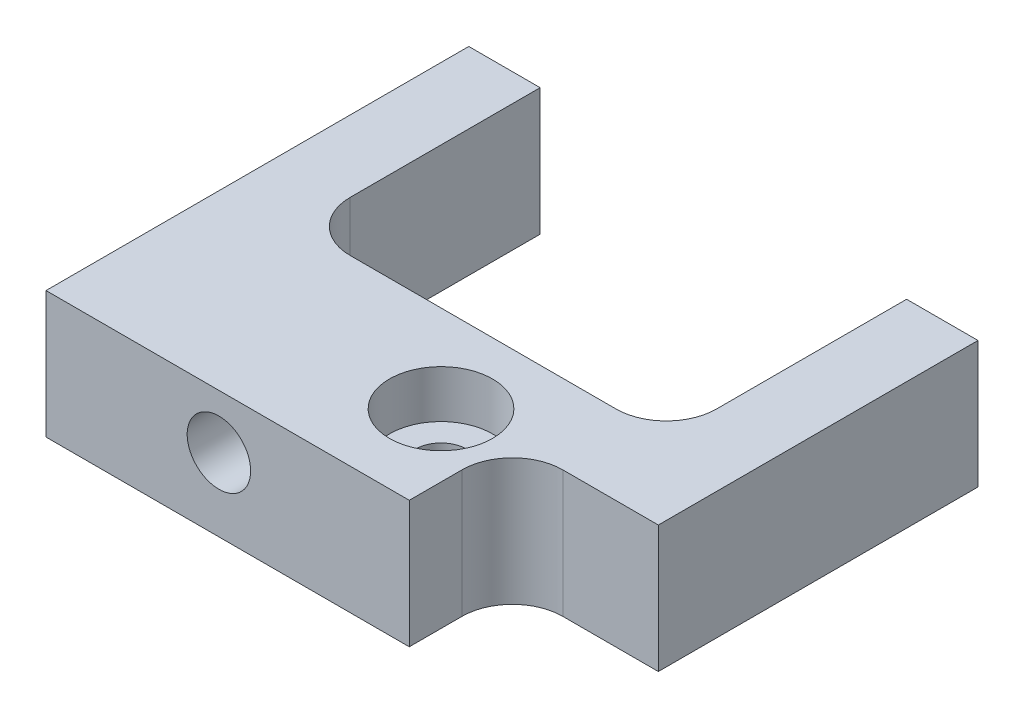
ISO-10303-21;
HEADER;
FILE_DESCRIPTION(('STEP AP214'),'2;1');
FILE_NAME('part.step','',(''),(''),'','','');
FILE_SCHEMA(('AUTOMOTIVE_DESIGN { 1 0 10303 214 1 1 1 1 }'));
ENDSEC;
DATA;
#1=APPLICATION_CONTEXT('core data for automotive mechanical design processes');
#2=APPLICATION_PROTOCOL_DEFINITION('international standard','automotive_design',2000,#1);
#3=PRODUCT_CONTEXT('',#1,'mechanical');
#4=PRODUCT('Part','Part','',(#3));
#5=PRODUCT_RELATED_PRODUCT_CATEGORY('part','',(#4));
#6=PRODUCT_DEFINITION_FORMATION('','',#4);
#7=PRODUCT_DEFINITION_CONTEXT('part definition',#1,'design');
#8=PRODUCT_DEFINITION('design','',#6,#7);
#9=PRODUCT_DEFINITION_SHAPE('','',#8);
#10=(LENGTH_UNIT() NAMED_UNIT(*) SI_UNIT(.MILLI.,.METRE.));
#11=(NAMED_UNIT(*) PLANE_ANGLE_UNIT() SI_UNIT($,.RADIAN.));
#12=(NAMED_UNIT(*) SI_UNIT($,.STERADIAN.) SOLID_ANGLE_UNIT());
#13=UNCERTAINTY_MEASURE_WITH_UNIT(LENGTH_MEASURE(1.E-05),#10,'distance_accuracy_value','');
#14=(GEOMETRIC_REPRESENTATION_CONTEXT(3) GLOBAL_UNCERTAINTY_ASSIGNED_CONTEXT((#13)) GLOBAL_UNIT_ASSIGNED_CONTEXT((#10,
#11,#12)) REPRESENTATION_CONTEXT('',''));
#15=CARTESIAN_POINT('',(0.,0.,0.));
#16=DIRECTION('',(0.,0.,1.));
#17=DIRECTION('',(1.,0.,0.));
#18=AXIS2_PLACEMENT_3D('',#15,#16,#17);
#19=CARTESIAN_POINT('',(0.,0.6,-20.65));
#20=DIRECTION('',(0.,0.,1.));
#21=DIRECTION('',(1.,0.,0.));
#22=AXIS2_PLACEMENT_3D('',#19,#20,#21);
#23=CYLINDRICAL_SURFACE('',#22,2.);
#24=CARTESIAN_POINT('',(0.,0.6,6.));
#25=DIRECTION('',(0.,0.,1.));
#26=DIRECTION('',(1.,0.,0.));
#27=AXIS2_PLACEMENT_3D('',#24,#25,#26);
#28=CIRCLE('',#27,2.);
#29=CARTESIAN_POINT('',(2.,0.6,6.));
#30=VERTEX_POINT('',#29);
#31=EDGE_CURVE('E216',#30,#30,#28,.T.);
#32=ORIENTED_EDGE('',*,*,#31,.T.);
#33=EDGE_LOOP('',(#32));
#34=FACE_BOUND('',#33,.T.);
#35=CARTESIAN_POINT('',(0.,0.6,-5.5));
#36=DIRECTION('',(0.,0.,1.));
#37=DIRECTION('',(1.,0.,0.));
#38=AXIS2_PLACEMENT_3D('',#35,#36,#37);
#39=CIRCLE('',#38,2.);
#40=CARTESIAN_POINT('',(2.,0.6,-5.5));
#41=VERTEX_POINT('',#40);
#42=EDGE_CURVE('E220',#41,#41,#39,.T.);
#43=ORIENTED_EDGE('',*,*,#42,.F.);
#44=EDGE_LOOP('',(#43));
#45=FACE_BOUND('',#44,.T.);
#46=CARTESIAN_POINT('',(2.,0.6,-1.6));
#47=CARTESIAN_POINT('',(2.00000081167368,0.530930232430908,-1.65180741795076));
#48=CARTESIAN_POINT('',(1.99641070395367,0.458493593826792,-1.699115629872));
#49=CARTESIAN_POINT('',(1.98012704087393,0.308900810169037,-1.78360734161533));
#50=CARTESIAN_POINT('',(1.96744188471003,0.231749079550651,-1.82080013925272));
#51=CARTESIAN_POINT('',(1.93158493327812,0.0751720335122647,-1.88449186499489));
#52=CARTESIAN_POINT('',(1.90838027108809,-0.00425967126894958,-1.91095678049753));
#53=CARTESIAN_POINT('',(1.85104297813442,-0.162026108753398,-1.95316471259814));
#54=CARTESIAN_POINT('',(1.81690813535857,-0.240360616057411,-1.96890555687711));
#55=CARTESIAN_POINT('',(1.73965206641096,-0.390182657924855,-1.99035271701722));
#56=CARTESIAN_POINT('',(1.69690429465275,-0.461815743414621,-1.99640430328593));
#57=CARTESIAN_POINT('',(1.60268097641294,-0.599320485146133,-2.00118457756281));
#58=CARTESIAN_POINT('',(1.55120278894355,-0.665190388833636,-1.99991104584322));
#59=CARTESIAN_POINT('',(1.43498824815135,-0.79615054910046,-1.99154760631992));
#60=CARTESIAN_POINT('',(1.3694350071139,-0.860475280037611,-1.98387740791269));
#61=CARTESIAN_POINT('',(1.23048079025559,-0.979333574383771,-1.96462162845022));
#62=CARTESIAN_POINT('',(1.1570734516767,-1.03385910197419,-1.95303285621111));
#63=CARTESIAN_POINT('',(0.990405979628008,-1.14083761045381,-1.92640580221497));
#64=CARTESIAN_POINT('',(0.895906296875015,-1.19130781741316,-1.91111739179622));
#65=CARTESIAN_POINT('',(0.699787270883814,-1.2766292102228,-1.88260580533857));
#66=CARTESIAN_POINT('',(0.598166856798842,-1.31147804100799,-1.86938294089523));
#67=CARTESIAN_POINT('',(0.384528928037567,-1.36593595822834,-1.84777354925079));
#68=CARTESIAN_POINT('',(0.272245825535434,-1.38463910775565,-1.83968060299791));
#69=CARTESIAN_POINT('',(0.0458874054833726,-1.40268973092312,-1.83188406880462));
#70=CARTESIAN_POINT('',(-0.0681866126450627,-1.40205064372051,-1.83217465590448));
#71=CARTESIAN_POINT('',(-0.285164572178313,-1.38232158760235,-1.84066746868414));
#72=CARTESIAN_POINT('',(-0.388233476384271,-1.36470801976279,-1.84823651616043));
#73=CARTESIAN_POINT('',(-0.589935560871737,-1.31384652395174,-1.86846584639397));
#74=CARTESIAN_POINT('',(-0.688566008650018,-1.28058910541913,-1.88112921901886));
#75=CARTESIAN_POINT('',(-0.882719390105117,-1.19787205747392,-1.90906058040478));
#76=CARTESIAN_POINT('',(-0.977997627654943,-1.14786552637516,-1.92440674591741));
#77=CARTESIAN_POINT('',(-1.15955897606969,-1.03308874546562,-1.95344429855302));
#78=CARTESIAN_POINT('',(-1.24583633547345,-0.968309139023642,-1.96713462849491));
#79=CARTESIAN_POINT('',(-1.41155089132897,-0.821393025739891,-1.98915941028867));
#80=CARTESIAN_POINT('',(-1.49040129047882,-0.73853059400089,-1.99717927513557));
#81=CARTESIAN_POINT('',(-1.5972127477114,-0.605061111948833,-2.00048948485742));
#82=CARTESIAN_POINT('',(-1.63090004515022,-0.559052530559337,-2.00014060479855));
#83=CARTESIAN_POINT('',(-1.69416251200746,-0.464448985210965,-1.9959635335001));
#84=CARTESIAN_POINT('',(-1.7237387456667,-0.41585469514182,-1.99213624466568));
#85=CARTESIAN_POINT('',(-1.79803587903694,-0.281171095771729,-1.97627175473062));
#86=CARTESIAN_POINT('',(-1.83848729704135,-0.193089320010061,-1.96032331380911));
#87=CARTESIAN_POINT('',(-1.90539212376168,-0.0152312666545765,-1.91479887308592));
#88=CARTESIAN_POINT('',(-1.9318566425983,0.0745436071832343,-1.88523372439649));
#89=CARTESIAN_POINT('',(-1.96866746103482,0.238852481739783,-1.8174418692137));
#90=CARTESIAN_POINT('',(-1.98075702546884,0.313754412672703,-1.78101783013734));
#91=CARTESIAN_POINT('',(-1.99636567355134,0.459051203164299,-1.69864278590973));
#92=CARTESIAN_POINT('',(-1.99988306922272,0.529445172386899,-1.65268990633237));
#93=CARTESIAN_POINT('',(-2.00011658431104,0.666955273371109,-1.5500090005869));
#94=CARTESIAN_POINT('',(-1.99651270706146,0.733772088196243,-1.49288283420442));
#95=CARTESIAN_POINT('',(-1.98414700408956,0.85909974044818,-1.37065814891648));
#96=CARTESIAN_POINT('',(-1.97538239442267,0.91760607364574,-1.30555534205408));
#97=CARTESIAN_POINT('',(-1.95328799158352,1.03448050470643,-1.15707789094646));
#98=CARTESIAN_POINT('',(-1.93943951797251,1.09118501797098,-1.07246906865233));
#99=CARTESIAN_POINT('',(-1.91135188176099,1.19112991016757,-0.895647483200536));
#100=CARTESIAN_POINT('',(-1.89711242088801,1.23435968057233,-0.803428800750606));
#101=CARTESIAN_POINT('',(-1.87001941903887,1.31053440638709,-0.60223790975111));
#102=CARTESIAN_POINT('',(-1.85750809303621,1.34174871383939,-0.492553504867468));
#103=CARTESIAN_POINT('',(-1.83961918954031,1.38509437338627,-0.26896038986554));
#104=CARTESIAN_POINT('',(-1.83423474348132,1.39724410116212,-0.15505585594007));
#105=CARTESIAN_POINT('',(-1.83225388534824,1.40177504594101,0.0662061879268429));
#106=CARTESIAN_POINT('',(-1.83513827814024,1.39532404085202,0.173536352909603));
#107=CARTESIAN_POINT('',(-1.84780026230027,1.36543337140907,0.385391843029078));
#108=CARTESIAN_POINT('',(-1.85758055948655,1.3419870383189,0.489916050445269));
#109=CARTESIAN_POINT('',(-1.88130399760412,1.27954141774594,0.691575995261232));
#110=CARTESIAN_POINT('',(-1.89516952431449,1.24082791568247,0.788810467881536));
#111=CARTESIAN_POINT('',(-1.92383805123334,1.14878594113083,0.9760329730363));
#112=CARTESIAN_POINT('',(-1.93864185145134,1.09544486410837,1.06601466895282));
#113=CARTESIAN_POINT('',(-1.96660649456734,0.970039239988648,1.24411331699019));
#114=CARTESIAN_POINT('',(-1.97952276673733,0.896773339291135,1.33143004993891));
#115=CARTESIAN_POINT('',(-1.9970018340399,0.735953168078853,1.49269118325014));
#116=CARTESIAN_POINT('',(-2.00157942041929,0.648424498168381,1.5666590515067));
#117=CARTESIAN_POINT('',(-1.99792708931293,0.484826250909298,1.68244782159104));
#118=CARTESIAN_POINT('',(-1.9925346133196,0.411127455459566,1.72771430332882));
#119=CARTESIAN_POINT('',(-1.97228553400472,0.259532164531531,1.80790906738676));
#120=CARTESIAN_POINT('',(-1.95743709423633,0.181639342902521,1.84284622919034));
#121=CARTESIAN_POINT('',(-1.91707168527508,0.0242873526634313,1.90193282767127));
#122=CARTESIAN_POINT('',(-1.89152824635684,-0.0551752328902149,1.92605518924901));
#123=CARTESIAN_POINT('',(-1.82954645398747,-0.212340721030698,1.96373574441791));
#124=CARTESIAN_POINT('',(-1.79310496292164,-0.290043109906346,1.97729089158538));
#125=CARTESIAN_POINT('',(-1.71136373138261,-0.438351715550521,1.99481107899165));
#126=CARTESIAN_POINT('',(-1.66639564813615,-0.509107426905006,1.99907756112358));
#127=CARTESIAN_POINT('',(-1.56791857614722,-0.644445526318661,2.00065276451401));
#128=CARTESIAN_POINT('',(-1.51440714805211,-0.709026142777655,1.99795949523263));
#129=CARTESIAN_POINT('',(-1.3932664707025,-0.837886655717559,1.98697505102131));
#130=CARTESIAN_POINT('',(-1.32471783147404,-0.901246134308137,1.97806540601163));
#131=CARTESIAN_POINT('',(-1.17979785027534,-1.01763206596044,1.95680614763648));
#132=CARTESIAN_POINT('',(-1.10341953102513,-1.07064917832831,1.94445344890854));
#133=CARTESIAN_POINT('',(-0.930611174751638,-1.17361620410465,1.91683918180251));
#134=CARTESIAN_POINT('',(-0.832976952264578,-1.2215222672066,1.90143950265747));
#135=CARTESIAN_POINT('',(-0.630867255300358,-1.30099840250781,1.87360209770341));
#136=CARTESIAN_POINT('',(-0.526392543709775,-1.33257029289404,1.86116404231382));
#137=CARTESIAN_POINT('',(-0.30980204904424,-1.37905197403248,1.84221278744531));
#138=CARTESIAN_POINT('',(-0.197549995458754,-1.39341808942808,1.83589406419166));
#139=CARTESIAN_POINT('',(0.0278877008999224,-1.40298213030672,1.83173546045223));
#140=CARTESIAN_POINT('',(0.141072817525358,-1.39819020750826,1.8338910894528));
#141=CARTESIAN_POINT('',(0.355819526239452,-1.37083636803646,1.84553290648091));
#142=CARTESIAN_POINT('',(0.457599488764074,-1.34968857796929,1.85443464609825));
#143=CARTESIAN_POINT('',(0.65627037675498,-1.29209407315778,1.87668620073566));
#144=CARTESIAN_POINT('',(0.753157232070508,-1.25563484954419,1.89003965079366));
#145=CARTESIAN_POINT('',(0.944960910720817,-1.16602573521248,1.91883823994639));
#146=CARTESIAN_POINT('',(1.03950055430254,-1.11209301122148,1.93435676253174));
#147=CARTESIAN_POINT('',(1.21885880929599,-0.989393472038473,1.96273473362634));
#148=CARTESIAN_POINT('',(1.30368205078825,-0.920633767636342,1.97559545100776));
#149=CARTESIAN_POINT('',(1.45077870732479,-0.77991152693392,1.99297615784251));
#150=CARTESIAN_POINT('',(1.51455050217948,-0.709630863559676,1.99838694076718));
#151=CARTESIAN_POINT('',(1.63153705090065,-0.56061874765793,2.0009961388745));
#152=CARTESIAN_POINT('',(1.68476064067449,-0.481894454035504,1.99820145882578));
#153=CARTESIAN_POINT('',(1.77945498065592,-0.317908136994111,1.98172846075181));
#154=CARTESIAN_POINT('',(1.82084276009074,-0.23260503874639,1.96797575010158));
#155=CARTESIAN_POINT('',(1.89037516714184,-0.0596621991097205,1.92766556519411));
#156=CARTESIAN_POINT('',(1.91852733772989,0.0279761812349006,1.90111540171992));
#157=CARTESIAN_POINT('',(1.95938749973833,0.191269888130147,1.8386509466133));
#158=CARTESIAN_POINT('',(1.97350968805391,0.267134590088476,1.8041827461507));
#159=CARTESIAN_POINT('',(1.99279851248597,0.414792764149142,1.72545596541142));
#160=CARTESIAN_POINT('',(1.99796319137545,0.486585343173608,1.68119524783907));
#161=CARTESIAN_POINT('',(2.00108397849849,0.626086116798666,1.58247710311655));
#162=CARTESIAN_POINT('',(1.99882403529726,0.693612556818483,1.52775849844612));
#163=CARTESIAN_POINT('',(1.98880175814885,0.820776597099821,1.41028362715986));
#164=CARTESIAN_POINT('',(1.98103686330874,0.880410510445559,1.3475236308407));
#165=CARTESIAN_POINT('',(1.96071137214926,0.999812730518181,1.20442043672629));
#166=CARTESIAN_POINT('',(1.94757831957524,1.0580433665156,1.12287503675407));
#167=CARTESIAN_POINT('',(1.92026107001239,1.16167153531078,0.952106894804565));
#168=CARTESIAN_POINT('',(1.90607594360953,1.20705754641604,0.862877353084684));
#169=CARTESIAN_POINT('',(1.87810742365832,1.2890856142956,0.666399859636045));
#170=CARTESIAN_POINT('',(1.86461212206336,1.32384335610252,0.558312665279804));
#171=CARTESIAN_POINT('',(1.84411281410941,1.37460894789826,0.337270760359234));
#172=CARTESIAN_POINT('',(1.83710288312593,1.39063391450044,0.224320591236239));
#173=CARTESIAN_POINT('',(1.83176302428134,1.40292287621779,0.002692968837738));
#174=CARTESIAN_POINT('',(1.83302507536412,1.40011561734224,-0.105923051901108));
#175=CARTESIAN_POINT('',(1.84291982065536,1.37704294075041,-0.320937355398722));
#176=CARTESIAN_POINT('',(1.85155430101119,1.3567732923418,-0.427335094325882));
#177=CARTESIAN_POINT('',(1.87351965177648,1.30056204027455,-0.631426625214853));
#178=CARTESIAN_POINT('',(1.88668220159995,1.26517239607616,-0.729292976581497));
#179=CARTESIAN_POINT('',(1.91465018828688,1.17976617656696,-0.918257574761771));
#180=CARTESIAN_POINT('',(1.92945726035384,1.12973496037857,-1.00934893200018));
#181=CARTESIAN_POINT('',(1.95866892098325,1.0096889039612,-1.19255486354033));
#182=CARTESIAN_POINT('',(1.97284748895516,0.938074953221956,-1.28366636456944));
#183=CARTESIAN_POINT('',(1.99350586232903,0.779652015677594,-1.45254808860173));
#184=CARTESIAN_POINT('',(1.99999890864414,0.692869458932587,-1.53034105885808));
#185=CARTESIAN_POINT('',(2.,0.6,-1.6));
#186=B_SPLINE_CURVE_WITH_KNOTS('',3,(#46,#47,#48,#49,#50,#51,#52,#53,#54,#55,#56,#57,#58,#59,
#60,#61,#62,#63,#64,#65,#66,#67,#68,#69,#70,#71,#72,#73,#74,#75,#76,#77,#78,#79,#80,#81,#82,#83,
#84,#85,#86,#87,#88,#89,#90,#91,#92,#93,#94,#95,#96,#97,#98,#99,#100,#101,#102,#103,#104,#105,
#106,#107,#108,#109,#110,#111,#112,#113,#114,#115,#116,#117,#118,#119,#120,#121,#122,#123,#124,
#125,#126,#127,#128,#129,#130,#131,#132,#133,#134,#135,#136,#137,#138,#139,#140,#141,#142,#143,
#144,#145,#146,#147,#148,#149,#150,#151,#152,#153,#154,#155,#156,#157,#158,#159,#160,#161,#162,
#163,#164,#165,#166,#167,#168,#169,#170,#171,#172,#173,#174,#175,#176,#177,#178,#179,#180,#181,
#182,#183,#184,#185),.UNSPECIFIED.,.T.,.F.,(4,2,2,2,2,2,2,2,2,2,2,2,2,2,2,2,2,2,2,2,2,2,2,2,2,2,
2,2,2,2,2,2,2,2,2,2,2,2,2,2,2,2,2,2,2,2,2,2,2,2,2,2,2,2,2,2,2,2,2,2,2,2,2,2,2,2,2,2,2,4),(0.,
0.258704692950136,0.517170781647821,0.776450042023576,1.0357818076389,1.28564852242651,
1.53559095821911,1.81103967058162,2.08671324358595,2.40997725003623,2.73328997511033,
3.07374408183514,3.41396164346818,3.72703074255344,4.04029001482903,4.3649793432232,
4.68987488984253,5.03162007465946,5.2024214366164,5.37317850014325,5.66588716123469,
5.95836296622569,6.20970981791408,6.4611061592326,6.72405597558775,6.98714776970556,
7.29429359962567,7.60168063508981,7.94405429443354,8.28609774863279,8.60714356501621,
8.92831542366395,9.24374075328691,9.55943874263811,9.90181610634699,10.2435855639794,
10.5024496992631,10.7610906535333,11.0203755541777,11.2797351764874,11.5305439865519,
11.7814245377111,12.0616774708878,12.3421823540458,12.670243015467,12.9982671519886,
13.3364038159761,13.6743613273226,13.9859779911024,14.2978497308254,14.6262662825671,
14.954525679737,15.2385252046247,15.5222858168686,15.80798942631,16.0935300153382,
16.3459002090257,16.5983255389719,16.8581605912355,17.118116597649,17.4201096724678,
17.722372784143,18.0636437401914,18.4046026239387,18.7288744956192,19.0532249522179,
19.3666296739816,19.6803488627194,20.0287978352966,20.3766456086884),.UNSPECIFIED.);
#187=CARTESIAN_POINT('',(2.,0.6,-1.6));
#188=VERTEX_POINT('',#187);
#189=EDGE_CURVE('E50',#188,#188,#186,.T.);
#190=ORIENTED_EDGE('',*,*,#189,.F.);
#191=EDGE_LOOP('',(#190));
#192=FACE_BOUND('',#191,.T.);
#193=ADVANCED_FACE('F46',(#34,#45,#192),#23,.F.);
#194=CARTESIAN_POINT('',(21.2,4.,-20.65));
#195=DIRECTION('',(-1.,0.,0.));
#196=DIRECTION('',(0.,0.,1.));
#197=AXIS2_PLACEMENT_3D('',#194,#195,#196);
#198=PLANE('',#197);
#199=DIRECTION('',(0.,0.,-1.));
#200=VECTOR('',#199,1.);
#201=CARTESIAN_POINT('',(21.2,-4.,-20.65));
#202=LINE('',#201,#200);
#203=CARTESIAN_POINT('',(21.2,-4.,-0.500000000000002));
#204=VERTEX_POINT('',#203);
#205=CARTESIAN_POINT('',(21.2,-4.,-20.65));
#206=VERTEX_POINT('',#205);
#207=EDGE_CURVE('E224',#204,#206,#202,.T.);
#208=ORIENTED_EDGE('',*,*,#207,.T.);
#209=DIRECTION('',(0.,-1.,0.));
#210=VECTOR('',#209,1.);
#211=CARTESIAN_POINT('',(21.2,4.,-20.65));
#212=LINE('',#211,#210);
#213=CARTESIAN_POINT('',(21.2,4.,-20.65));
#214=VERTEX_POINT('',#213);
#215=EDGE_CURVE('E314',#214,#206,#212,.T.);
#216=ORIENTED_EDGE('',*,*,#215,.F.);
#217=DIRECTION('',(0.,0.,-1.));
#218=VECTOR('',#217,1.);
#219=CARTESIAN_POINT('',(21.2,4.,-20.65));
#220=LINE('',#219,#218);
#221=CARTESIAN_POINT('',(21.2,4.,-0.500000000000002));
#222=VERTEX_POINT('',#221);
#223=EDGE_CURVE('E225',#222,#214,#220,.T.);
#224=ORIENTED_EDGE('',*,*,#223,.F.);
#225=DIRECTION('',(0.,-1.,0.));
#226=VECTOR('',#225,1.);
#227=CARTESIAN_POINT('',(21.2,4.,-0.500000000000002));
#228=LINE('',#227,#226);
#229=EDGE_CURVE('E258',#222,#204,#228,.T.);
#230=ORIENTED_EDGE('',*,*,#229,.T.);
#231=EDGE_LOOP('',(#208,#216,#224,#230));
#232=FACE_BOUND('',#231,.T.);
#233=ADVANCED_FACE('F394',(#232),#198,.F.);
#234=CARTESIAN_POINT('',(21.2,4.,-20.65));
#235=DIRECTION('',(0.,0.,1.));
#236=DIRECTION('',(1.,0.,0.));
#237=AXIS2_PLACEMENT_3D('',#234,#235,#236);
#238=PLANE('',#237);
#239=CARTESIAN_POINT('',(19.05,0.6,-20.65));
#240=DIRECTION('',(0.,0.,-1.));
#241=DIRECTION('',(-1.,0.,0.));
#242=AXIS2_PLACEMENT_3D('',#239,#240,#241);
#243=CIRCLE('',#242,0.750000000000001);
#244=CARTESIAN_POINT('',(18.3,0.6,-20.65));
#245=VERTEX_POINT('',#244);
#246=EDGE_CURVE('E191',#245,#245,#243,.T.);
#247=ORIENTED_EDGE('',*,*,#246,.F.);
#248=EDGE_LOOP('',(#247));
#249=FACE_BOUND('',#248,.T.);
#250=DIRECTION('',(-1.,0.,0.));
#251=VECTOR('',#250,1.);
#252=CARTESIAN_POINT('',(21.2,-4.,-20.65));
#253=LINE('',#252,#251);
#254=CARTESIAN_POINT('',(16.7,-4.,-20.65));
#255=VERTEX_POINT('',#254);
#256=EDGE_CURVE('E262',#206,#255,#253,.T.);
#257=ORIENTED_EDGE('',*,*,#256,.T.);
#258=DIRECTION('',(0.,-1.,0.));
#259=VECTOR('',#258,1.);
#260=CARTESIAN_POINT('',(16.7,4.,-20.65));
#261=LINE('',#260,#259);
#262=CARTESIAN_POINT('',(16.7,4.,-20.65));
#263=VERTEX_POINT('',#262);
#264=EDGE_CURVE('E310',#263,#255,#261,.T.);
#265=ORIENTED_EDGE('',*,*,#264,.F.);
#266=DIRECTION('',(-1.,0.,0.));
#267=VECTOR('',#266,1.);
#268=CARTESIAN_POINT('',(21.2,4.,-20.65));
#269=LINE('',#268,#267);
#270=EDGE_CURVE('E229',#214,#263,#269,.T.);
#271=ORIENTED_EDGE('',*,*,#270,.F.);
#272=ORIENTED_EDGE('',*,*,#215,.T.);
#273=EDGE_LOOP('',(#257,#265,#271,#272));
#274=FACE_BOUND('',#273,.T.);
#275=ADVANCED_FACE('F400',(#249,#274),#238,.F.);
#276=CARTESIAN_POINT('',(16.7,4.,-20.65));
#277=DIRECTION('',(1.,0.,0.));
#278=DIRECTION('',(0.,0.,-1.));
#279=AXIS2_PLACEMENT_3D('',#276,#277,#278);
#280=PLANE('',#279);
#281=DIRECTION('',(0.,0.,1.));
#282=VECTOR('',#281,1.);
#283=CARTESIAN_POINT('',(16.7,-4.,-20.65));
#284=LINE('',#283,#282);
#285=CARTESIAN_POINT('',(16.7,-4.,-8.675));
#286=VERTEX_POINT('',#285);
#287=EDGE_CURVE('E265',#255,#286,#284,.T.);
#288=ORIENTED_EDGE('',*,*,#287,.T.);
#289=DIRECTION('',(0.,-1.,0.));
#290=VECTOR('',#289,1.);
#291=CARTESIAN_POINT('',(16.7,4.,-8.675));
#292=LINE('',#291,#290);
#293=CARTESIAN_POINT('',(16.7,4.,-8.675));
#294=VERTEX_POINT('',#293);
#295=EDGE_CURVE('E332',#286,#294,#292,.F.);
#296=ORIENTED_EDGE('',*,*,#295,.T.);
#297=DIRECTION('',(0.,0.,1.));
#298=VECTOR('',#297,1.);
#299=CARTESIAN_POINT('',(16.7,4.,-20.65));
#300=LINE('',#299,#298);
#301=EDGE_CURVE('E232',#263,#294,#300,.T.);
#302=ORIENTED_EDGE('',*,*,#301,.F.);
#303=ORIENTED_EDGE('',*,*,#264,.T.);
#304=EDGE_LOOP('',(#288,#296,#302,#303));
#305=FACE_BOUND('',#304,.T.);
#306=ADVANCED_FACE('F402',(#305),#280,.F.);
#307=CARTESIAN_POINT('',(16.7,4.,-5.5));
#308=DIRECTION('',(0.,0.,1.));
#309=DIRECTION('',(1.,0.,0.));
#310=AXIS2_PLACEMENT_3D('',#307,#308,#309);
#311=PLANE('',#310);
#312=ORIENTED_EDGE('',*,*,#42,.T.);
#313=EDGE_LOOP('',(#312));
#314=FACE_BOUND('',#313,.T.);
#315=DIRECTION('',(-1.,0.,0.));
#316=VECTOR('',#315,1.);
#317=CARTESIAN_POINT('',(16.7,4.,-5.5));
#318=LINE('',#317,#316);
#319=CARTESIAN_POINT('',(13.525,4.,-5.5));
#320=VERTEX_POINT('',#319);
#321=CARTESIAN_POINT('',(-3.22500000000005,4.,-5.5));
#322=VERTEX_POINT('',#321);
#323=EDGE_CURVE('E236',#320,#322,#318,.T.);
#324=ORIENTED_EDGE('',*,*,#323,.F.);
#325=DIRECTION('',(0.,-1.,0.));
#326=VECTOR('',#325,1.);
#327=CARTESIAN_POINT('',(13.525,-4.,-5.5));
#328=LINE('',#327,#326);
#329=CARTESIAN_POINT('',(13.525,-4.,-5.5));
#330=VERTEX_POINT('',#329);
#331=EDGE_CURVE('E328',#320,#330,#328,.T.);
#332=ORIENTED_EDGE('',*,*,#331,.T.);
#333=DIRECTION('',(-1.,0.,0.));
#334=VECTOR('',#333,1.);
#335=CARTESIAN_POINT('',(16.7,-4.,-5.5));
#336=LINE('',#335,#334);
#337=CARTESIAN_POINT('',(-3.22500000000005,-4.,-5.5));
#338=VERTEX_POINT('',#337);
#339=EDGE_CURVE('E269',#330,#338,#336,.T.);
#340=ORIENTED_EDGE('',*,*,#339,.T.);
#341=DIRECTION('',(0.,-1.,0.));
#342=VECTOR('',#341,1.);
#343=CARTESIAN_POINT('',(-3.22500000000005,4.,-5.5));
#344=LINE('',#343,#342);
#345=EDGE_CURVE('E325',#338,#322,#344,.F.);
#346=ORIENTED_EDGE('',*,*,#345,.T.);
#347=EDGE_LOOP('',(#324,#332,#340,#346));
#348=FACE_BOUND('',#347,.T.);
#349=ADVANCED_FACE('F358',(#314,#348),#311,.F.);
#350=CARTESIAN_POINT('',(-6.40000000000005,4.,-5.5));
#351=DIRECTION('',(-1.,0.,0.));
#352=DIRECTION('',(0.,0.,1.));
#353=AXIS2_PLACEMENT_3D('',#350,#351,#352);
#354=PLANE('',#353);
#355=DIRECTION('',(0.,0.,-1.));
#356=VECTOR('',#355,1.);
#357=CARTESIAN_POINT('',(-6.40000000000005,4.,-5.5));
#358=LINE('',#357,#356);
#359=CARTESIAN_POINT('',(-6.40000000000005,4.,-8.675));
#360=VERTEX_POINT('',#359);
#361=CARTESIAN_POINT('',(-6.40000000000005,4.,-20.65));
#362=VERTEX_POINT('',#361);
#363=EDGE_CURVE('E239',#360,#362,#358,.T.);
#364=ORIENTED_EDGE('',*,*,#363,.F.);
#365=DIRECTION('',(0.,-1.,0.));
#366=VECTOR('',#365,1.);
#367=CARTESIAN_POINT('',(-6.40000000000005,-4.,-8.675));
#368=LINE('',#367,#366);
#369=CARTESIAN_POINT('',(-6.40000000000005,-4.,-8.675));
#370=VERTEX_POINT('',#369);
#371=EDGE_CURVE('E335',#360,#370,#368,.T.);
#372=ORIENTED_EDGE('',*,*,#371,.T.);
#373=DIRECTION('',(0.,0.,-1.));
#374=VECTOR('',#373,1.);
#375=CARTESIAN_POINT('',(-6.40000000000005,-4.,-5.5));
#376=LINE('',#375,#374);
#377=CARTESIAN_POINT('',(-6.40000000000005,-4.,-20.65));
#378=VERTEX_POINT('',#377);
#379=EDGE_CURVE('E273',#370,#378,#376,.T.);
#380=ORIENTED_EDGE('',*,*,#379,.T.);
#381=DIRECTION('',(0.,-1.,0.));
#382=VECTOR('',#381,1.);
#383=CARTESIAN_POINT('',(-6.40000000000005,4.,-20.65));
#384=LINE('',#383,#382);
#385=EDGE_CURVE('E306',#362,#378,#384,.T.);
#386=ORIENTED_EDGE('',*,*,#385,.F.);
#387=EDGE_LOOP('',(#364,#372,#380,#386));
#388=FACE_BOUND('',#387,.T.);
#389=ADVANCED_FACE('F361',(#388),#354,.F.);
#390=CARTESIAN_POINT('',(-10.9,4.,-20.65));
#391=DIRECTION('',(0.,0.,1.));
#392=DIRECTION('',(1.,0.,0.));
#393=AXIS2_PLACEMENT_3D('',#390,#391,#392);
#394=PLANE('',#393);
#395=CARTESIAN_POINT('',(-8.75000000000004,0.6,-20.65));
#396=DIRECTION('',(0.,0.,-1.));
#397=DIRECTION('',(-1.,0.,0.));
#398=AXIS2_PLACEMENT_3D('',#395,#396,#397);
#399=CIRCLE('',#398,0.749999999999999);
#400=CARTESIAN_POINT('',(-9.50000000000004,0.6,-20.65));
#401=VERTEX_POINT('',#400);
#402=EDGE_CURVE('E190',#401,#401,#399,.T.);
#403=ORIENTED_EDGE('',*,*,#402,.F.);
#404=EDGE_LOOP('',(#403));
#405=FACE_BOUND('',#404,.T.);
#406=DIRECTION('',(-1.,0.,0.));
#407=VECTOR('',#406,1.);
#408=CARTESIAN_POINT('',(-10.9,-4.,-20.65));
#409=LINE('',#408,#407);
#410=CARTESIAN_POINT('',(-10.9,-4.,-20.65));
#411=VERTEX_POINT('',#410);
#412=EDGE_CURVE('E276',#378,#411,#409,.T.);
#413=ORIENTED_EDGE('',*,*,#412,.T.);
#414=DIRECTION('',(0.,-1.,0.));
#415=VECTOR('',#414,1.);
#416=CARTESIAN_POINT('',(-10.9,4.,-20.65));
#417=LINE('',#416,#415);
#418=CARTESIAN_POINT('',(-10.9,4.,-20.65));
#419=VERTEX_POINT('',#418);
#420=EDGE_CURVE('E302',#419,#411,#417,.T.);
#421=ORIENTED_EDGE('',*,*,#420,.F.);
#422=DIRECTION('',(-1.,0.,0.));
#423=VECTOR('',#422,1.);
#424=CARTESIAN_POINT('',(-10.9,4.,-20.65));
#425=LINE('',#424,#423);
#426=EDGE_CURVE('E242',#362,#419,#425,.T.);
#427=ORIENTED_EDGE('',*,*,#426,.F.);
#428=ORIENTED_EDGE('',*,*,#385,.T.);
#429=EDGE_LOOP('',(#413,#421,#427,#428));
#430=FACE_BOUND('',#429,.T.);
#431=ADVANCED_FACE('F369',(#405,#430),#394,.F.);
#432=CARTESIAN_POINT('',(-10.9,4.,6.));
#433=DIRECTION('',(1.,0.,0.));
#434=DIRECTION('',(0.,0.,-1.));
#435=AXIS2_PLACEMENT_3D('',#432,#433,#434);
#436=PLANE('',#435);
#437=CARTESIAN_POINT('',(-10.9,-0.6,0.));
#438=DIRECTION('',(1.,0.,0.));
#439=DIRECTION('',(0.,0.,-1.));
#440=AXIS2_PLACEMENT_3D('',#437,#438,#439);
#441=CIRCLE('',#440,2.);
#442=CARTESIAN_POINT('',(-10.9,-0.6,-2.));
#443=VERTEX_POINT('',#442);
#444=EDGE_CURVE('E208',#443,#443,#441,.T.);
#445=ORIENTED_EDGE('',*,*,#444,.T.);
#446=EDGE_LOOP('',(#445));
#447=FACE_BOUND('',#446,.T.);
#448=DIRECTION('',(0.,0.,1.));
#449=VECTOR('',#448,1.);
#450=CARTESIAN_POINT('',(-10.9,-4.,6.));
#451=LINE('',#450,#449);
#452=CARTESIAN_POINT('',(-10.9,-4.,6.));
#453=VERTEX_POINT('',#452);
#454=EDGE_CURVE('E279',#411,#453,#451,.T.);
#455=ORIENTED_EDGE('',*,*,#454,.T.);
#456=DIRECTION('',(0.,-1.,0.));
#457=VECTOR('',#456,1.);
#458=CARTESIAN_POINT('',(-10.9,4.,6.));
#459=LINE('',#458,#457);
#460=CARTESIAN_POINT('',(-10.9,4.,6.));
#461=VERTEX_POINT('',#460);
#462=EDGE_CURVE('E298',#461,#453,#459,.T.);
#463=ORIENTED_EDGE('',*,*,#462,.F.);
#464=DIRECTION('',(0.,0.,1.));
#465=VECTOR('',#464,1.);
#466=CARTESIAN_POINT('',(-10.9,4.,6.));
#467=LINE('',#466,#465);
#468=EDGE_CURVE('E245',#419,#461,#467,.T.);
#469=ORIENTED_EDGE('',*,*,#468,.F.);
#470=ORIENTED_EDGE('',*,*,#420,.T.);
#471=EDGE_LOOP('',(#455,#463,#469,#470));
#472=FACE_BOUND('',#471,.T.);
#473=ADVANCED_FACE('F372',(#447,#472),#436,.F.);
#474=CARTESIAN_POINT('',(12.,4.,6.));
#475=DIRECTION('',(0.,0.,-1.));
#476=DIRECTION('',(-1.,0.,0.));
#477=AXIS2_PLACEMENT_3D('',#474,#475,#476);
#478=PLANE('',#477);
#479=ORIENTED_EDGE('',*,*,#31,.F.);
#480=EDGE_LOOP('',(#479));
#481=FACE_BOUND('',#480,.T.);
#482=DIRECTION('',(1.,0.,0.));
#483=VECTOR('',#482,1.);
#484=CARTESIAN_POINT('',(12.,-4.,6.));
#485=LINE('',#484,#483);
#486=CARTESIAN_POINT('',(12.,-4.,6.));
#487=VERTEX_POINT('',#486);
#488=EDGE_CURVE('E282',#453,#487,#485,.T.);
#489=ORIENTED_EDGE('',*,*,#488,.T.);
#490=DIRECTION('',(0.,-1.,0.));
#491=VECTOR('',#490,1.);
#492=CARTESIAN_POINT('',(12.,4.,6.));
#493=LINE('',#492,#491);
#494=CARTESIAN_POINT('',(12.,4.,6.));
#495=VERTEX_POINT('',#494);
#496=EDGE_CURVE('E294',#495,#487,#493,.T.);
#497=ORIENTED_EDGE('',*,*,#496,.F.);
#498=DIRECTION('',(1.,0.,0.));
#499=VECTOR('',#498,1.);
#500=CARTESIAN_POINT('',(12.,4.,6.));
#501=LINE('',#500,#499);
#502=EDGE_CURVE('E248',#461,#495,#501,.T.);
#503=ORIENTED_EDGE('',*,*,#502,.F.);
#504=ORIENTED_EDGE('',*,*,#462,.T.);
#505=EDGE_LOOP('',(#489,#497,#503,#504));
#506=FACE_BOUND('',#505,.T.);
#507=ADVANCED_FACE('F377',(#481,#506),#478,.F.);
#508=CARTESIAN_POINT('',(12.,4.,-0.500000000000001));
#509=DIRECTION('',(-1.,0.,0.));
#510=DIRECTION('',(0.,0.,1.));
#511=AXIS2_PLACEMENT_3D('',#508,#509,#510);
#512=PLANE('',#511);
#513=DIRECTION('',(0.,0.,-1.));
#514=VECTOR('',#513,1.);
#515=CARTESIAN_POINT('',(12.,-4.,-0.500000000000001));
#516=LINE('',#515,#514);
#517=CARTESIAN_POINT('',(12.,-4.,2.675));
#518=VERTEX_POINT('',#517);
#519=EDGE_CURVE('E285',#487,#518,#516,.T.);
#520=ORIENTED_EDGE('',*,*,#519,.T.);
#521=DIRECTION('',(0.,-1.,0.));
#522=VECTOR('',#521,1.);
#523=CARTESIAN_POINT('',(12.,4.,2.675));
#524=LINE('',#523,#522);
#525=CARTESIAN_POINT('',(12.,4.,2.675));
#526=VERTEX_POINT('',#525);
#527=EDGE_CURVE('E322',#518,#526,#524,.F.);
#528=ORIENTED_EDGE('',*,*,#527,.T.);
#529=DIRECTION('',(0.,0.,-1.));
#530=VECTOR('',#529,1.);
#531=CARTESIAN_POINT('',(12.,4.,-0.500000000000001));
#532=LINE('',#531,#530);
#533=EDGE_CURVE('E251',#495,#526,#532,.T.);
#534=ORIENTED_EDGE('',*,*,#533,.F.);
#535=ORIENTED_EDGE('',*,*,#496,.T.);
#536=EDGE_LOOP('',(#520,#528,#534,#535));
#537=FACE_BOUND('',#536,.T.);
#538=ADVANCED_FACE('F432',(#537),#512,.F.);
#539=CARTESIAN_POINT('',(21.2,4.,-0.500000000000002));
#540=DIRECTION('',(0.,0.,-1.));
#541=DIRECTION('',(-1.,0.,0.));
#542=AXIS2_PLACEMENT_3D('',#539,#540,#541);
#543=PLANE('',#542);
#544=DIRECTION('',(1.,0.,0.));
#545=VECTOR('',#544,1.);
#546=CARTESIAN_POINT('',(21.2,4.,-0.500000000000002));
#547=LINE('',#546,#545);
#548=CARTESIAN_POINT('',(15.175,4.,-0.500000000000001));
#549=VERTEX_POINT('',#548);
#550=EDGE_CURVE('E255',#549,#222,#547,.T.);
#551=ORIENTED_EDGE('',*,*,#550,.F.);
#552=DIRECTION('',(0.,-1.,0.));
#553=VECTOR('',#552,1.);
#554=CARTESIAN_POINT('',(15.175,-4.,-0.500000000000001));
#555=LINE('',#554,#553);
#556=CARTESIAN_POINT('',(15.175,-4.,-0.500000000000001));
#557=VERTEX_POINT('',#556);
#558=EDGE_CURVE('E318',#549,#557,#555,.T.);
#559=ORIENTED_EDGE('',*,*,#558,.T.);
#560=DIRECTION('',(1.,0.,0.));
#561=VECTOR('',#560,1.);
#562=CARTESIAN_POINT('',(21.2,-4.,-0.500000000000002));
#563=LINE('',#562,#561);
#564=EDGE_CURVE('E230',#557,#204,#563,.T.);
#565=ORIENTED_EDGE('',*,*,#564,.T.);
#566=ORIENTED_EDGE('',*,*,#229,.F.);
#567=EDGE_LOOP('',(#551,#559,#565,#566));
#568=FACE_BOUND('',#567,.T.);
#569=ADVANCED_FACE('F388',(#568),#543,.F.);
#570=CARTESIAN_POINT('',(0.,4.,0.));
#571=DIRECTION('',(0.,-1.,0.));
#572=DIRECTION('',(0.,0.,-1.));
#573=AXIS2_PLACEMENT_3D('',#570,#571,#572);
#574=PLANE('',#573);
#575=CARTESIAN_POINT('',(8.,4.,0.));
#576=DIRECTION('',(0.,1.,0.));
#577=DIRECTION('',(0.,0.,1.));
#578=AXIS2_PLACEMENT_3D('',#575,#576,#577);
#579=CIRCLE('',#578,3.25);
#580=CARTESIAN_POINT('',(8.,4.,3.25));
#581=VERTEX_POINT('',#580);
#582=EDGE_CURVE('E496',#581,#581,#579,.T.);
#583=ORIENTED_EDGE('',*,*,#582,.F.);
#584=EDGE_LOOP('',(#583));
#585=FACE_BOUND('',#584,.T.);
#586=ORIENTED_EDGE('',*,*,#223,.T.);
#587=ORIENTED_EDGE('',*,*,#270,.T.);
#588=ORIENTED_EDGE('',*,*,#301,.T.);
#589=CARTESIAN_POINT('',(13.525,4.,-8.675));
#590=DIRECTION('',(0.,-1.,0.));
#591=DIRECTION('',(0.,0.,-1.));
#592=AXIS2_PLACEMENT_3D('',#589,#590,#591);
#593=CIRCLE('',#592,3.175);
#594=EDGE_CURVE('E346',#294,#320,#593,.T.);
#595=ORIENTED_EDGE('',*,*,#594,.T.);
#596=ORIENTED_EDGE('',*,*,#323,.T.);
#597=CARTESIAN_POINT('',(-3.22500000000005,4.,-8.675));
#598=DIRECTION('',(0.,-1.,0.));
#599=DIRECTION('',(0.,0.,-1.));
#600=AXIS2_PLACEMENT_3D('',#597,#598,#599);
#601=CIRCLE('',#600,3.175);
#602=EDGE_CURVE('E11',#322,#360,#601,.T.);
#603=ORIENTED_EDGE('',*,*,#602,.T.);
#604=ORIENTED_EDGE('',*,*,#363,.T.);
#605=ORIENTED_EDGE('',*,*,#426,.T.);
#606=ORIENTED_EDGE('',*,*,#468,.T.);
#607=ORIENTED_EDGE('',*,*,#502,.T.);
#608=ORIENTED_EDGE('',*,*,#533,.T.);
#609=CARTESIAN_POINT('',(15.175,4.,2.675));
#610=DIRECTION('',(0.,-1.,0.));
#611=DIRECTION('',(0.,0.,-1.));
#612=AXIS2_PLACEMENT_3D('',#609,#610,#611);
#613=CIRCLE('',#612,3.175);
#614=EDGE_CURVE('E340',#526,#549,#613,.T.);
#615=ORIENTED_EDGE('',*,*,#614,.T.);
#616=ORIENTED_EDGE('',*,*,#550,.T.);
#617=EDGE_LOOP('',(#586,#587,#588,#595,#596,#603,#604,#605,#606,#607,#608,#615,#616));
#618=FACE_BOUND('',#617,.T.);
#619=ADVANCED_FACE('F364',(#585,#618),#574,.F.);
#620=CARTESIAN_POINT('',(0.,-4.,0.));
#621=DIRECTION('',(0.,-1.,0.));
#622=DIRECTION('',(0.,0.,-1.));
#623=AXIS2_PLACEMENT_3D('',#620,#621,#622);
#624=PLANE('',#623);
#625=CARTESIAN_POINT('',(8.,-4.,0.));
#626=DIRECTION('',(0.,-1.,0.));
#627=DIRECTION('',(0.,0.,-1.));
#628=AXIS2_PLACEMENT_3D('',#625,#626,#627);
#629=CIRCLE('',#628,1.6);
#630=CARTESIAN_POINT('',(8.,-4.,-1.6));
#631=VERTEX_POINT('',#630);
#632=EDGE_CURVE('E201',#631,#631,#629,.T.);
#633=ORIENTED_EDGE('',*,*,#632,.F.);
#634=EDGE_LOOP('',(#633));
#635=FACE_BOUND('',#634,.T.);
#636=ORIENTED_EDGE('',*,*,#207,.F.);
#637=ORIENTED_EDGE('',*,*,#564,.F.);
#638=CARTESIAN_POINT('',(15.175,-4.,2.675));
#639=DIRECTION('',(0.,-1.,0.));
#640=DIRECTION('',(0.,0.,-1.));
#641=AXIS2_PLACEMENT_3D('',#638,#639,#640);
#642=CIRCLE('',#641,3.175);
#643=EDGE_CURVE('E337',#557,#518,#642,.F.);
#644=ORIENTED_EDGE('',*,*,#643,.T.);
#645=ORIENTED_EDGE('',*,*,#519,.F.);
#646=ORIENTED_EDGE('',*,*,#488,.F.);
#647=ORIENTED_EDGE('',*,*,#454,.F.);
#648=ORIENTED_EDGE('',*,*,#412,.F.);
#649=ORIENTED_EDGE('',*,*,#379,.F.);
#650=CARTESIAN_POINT('',(-3.22500000000005,-4.,-8.675));
#651=DIRECTION('',(0.,-1.,0.));
#652=DIRECTION('',(0.,0.,-1.));
#653=AXIS2_PLACEMENT_3D('',#650,#651,#652);
#654=CIRCLE('',#653,3.175);
#655=EDGE_CURVE('E61',#370,#338,#654,.F.);
#656=ORIENTED_EDGE('',*,*,#655,.T.);
#657=ORIENTED_EDGE('',*,*,#339,.F.);
#658=CARTESIAN_POINT('',(13.525,-4.,-8.675));
#659=DIRECTION('',(0.,-1.,0.));
#660=DIRECTION('',(0.,0.,-1.));
#661=AXIS2_PLACEMENT_3D('',#658,#659,#660);
#662=CIRCLE('',#661,3.175);
#663=EDGE_CURVE('E343',#330,#286,#662,.F.);
#664=ORIENTED_EDGE('',*,*,#663,.T.);
#665=ORIENTED_EDGE('',*,*,#287,.F.);
#666=ORIENTED_EDGE('',*,*,#256,.F.);
#667=EDGE_LOOP('',(#636,#637,#644,#645,#646,#647,#648,#649,#656,#657,#664,#665,#666));
#668=FACE_BOUND('',#667,.T.);
#669=ADVANCED_FACE('F354',(#635,#668),#624,.T.);
#670=CARTESIAN_POINT('',(15.175,4.,2.675));
#671=DIRECTION('',(0.,1.,0.));
#672=DIRECTION('',(0.,0.,1.));
#673=AXIS2_PLACEMENT_3D('',#670,#671,#672);
#674=CYLINDRICAL_SURFACE('',#673,3.175);
#675=ORIENTED_EDGE('',*,*,#614,.F.);
#676=ORIENTED_EDGE('',*,*,#527,.F.);
#677=ORIENTED_EDGE('',*,*,#643,.F.);
#678=ORIENTED_EDGE('',*,*,#558,.F.);
#679=EDGE_LOOP('',(#675,#676,#677,#678));
#680=FACE_BOUND('',#679,.T.);
#681=ADVANCED_FACE('F385',(#680),#674,.F.);
#682=CARTESIAN_POINT('',(13.525,4.,-8.675));
#683=DIRECTION('',(0.,1.,0.));
#684=DIRECTION('',(0.,0.,1.));
#685=AXIS2_PLACEMENT_3D('',#682,#683,#684);
#686=CYLINDRICAL_SURFACE('',#685,3.175);
#687=ORIENTED_EDGE('',*,*,#594,.F.);
#688=ORIENTED_EDGE('',*,*,#295,.F.);
#689=ORIENTED_EDGE('',*,*,#663,.F.);
#690=ORIENTED_EDGE('',*,*,#331,.F.);
#691=EDGE_LOOP('',(#687,#688,#689,#690));
#692=FACE_BOUND('',#691,.T.);
#693=ADVANCED_FACE('F405',(#692),#686,.F.);
#694=CARTESIAN_POINT('',(-3.22500000000005,4.,-8.675));
#695=DIRECTION('',(0.,1.,0.));
#696=DIRECTION('',(0.,0.,1.));
#697=AXIS2_PLACEMENT_3D('',#694,#695,#696);
#698=CYLINDRICAL_SURFACE('',#697,3.175);
#699=ORIENTED_EDGE('',*,*,#602,.F.);
#700=ORIENTED_EDGE('',*,*,#345,.F.);
#701=ORIENTED_EDGE('',*,*,#655,.F.);
#702=ORIENTED_EDGE('',*,*,#371,.F.);
#703=EDGE_LOOP('',(#699,#700,#701,#702));
#704=FACE_BOUND('',#703,.T.);
#705=ADVANCED_FACE('F48',(#704),#698,.F.);
#706=CARTESIAN_POINT('',(4.5,-0.6,0.));
#707=DIRECTION('',(-1.,0.,0.));
#708=DIRECTION('',(0.,0.,1.));
#709=AXIS2_PLACEMENT_3D('',#706,#707,#708);
#710=CYLINDRICAL_SURFACE('',#709,2.);
#711=CARTESIAN_POINT('',(4.5,-0.6,0.));
#712=DIRECTION('',(1.,0.,0.));
#713=DIRECTION('',(0.,0.,-1.));
#714=AXIS2_PLACEMENT_3D('',#711,#712,#713);
#715=CIRCLE('',#714,2.);
#716=CARTESIAN_POINT('',(4.5,-0.6,-2.));
#717=VERTEX_POINT('',#716);
#718=EDGE_CURVE('E212',#717,#717,#715,.T.);
#719=ORIENTED_EDGE('',*,*,#718,.T.);
#720=EDGE_LOOP('',(#719));
#721=FACE_BOUND('',#720,.T.);
#722=ORIENTED_EDGE('',*,*,#444,.F.);
#723=EDGE_LOOP('',(#722));
#724=FACE_BOUND('',#723,.T.);
#725=ORIENTED_EDGE('',*,*,#189,.T.);
#726=EDGE_LOOP('',(#725));
#727=FACE_BOUND('',#726,.T.);
#728=ADVANCED_FACE('F411',(#721,#724,#727),#710,.F.);
#729=CARTESIAN_POINT('',(4.5,-0.6,0.));
#730=DIRECTION('',(1.,0.,0.));
#731=DIRECTION('',(0.,0.,-1.));
#732=AXIS2_PLACEMENT_3D('',#729,#730,#731);
#733=PLANE('',#732);
#734=ORIENTED_EDGE('',*,*,#718,.F.);
#735=EDGE_LOOP('',(#734));
#736=FACE_BOUND('',#735,.T.);
#737=ADVANCED_FACE('F473',(#736),#733,.F.);
#738=CARTESIAN_POINT('',(-8.75000000000004,0.6,-13.65));
#739=DIRECTION('',(0.,0.,-1.));
#740=DIRECTION('',(-1.,0.,0.));
#741=AXIS2_PLACEMENT_3D('',#738,#739,#740);
#742=CONICAL_SURFACE('',#741,0.749999999999999,1.02974425867665);
#743=CARTESIAN_POINT('',(-8.75000000000004,0.6,-13.1993545357293));
#744=VERTEX_POINT('',#743);
#745=VERTEX_LOOP('',#744);
#746=FACE_BOUND('',#745,.T.);
#747=CARTESIAN_POINT('',(-8.75000000000004,0.6,-13.65));
#748=DIRECTION('',(0.,0.,-1.));
#749=DIRECTION('',(-1.,0.,0.));
#750=AXIS2_PLACEMENT_3D('',#747,#748,#749);
#751=CIRCLE('',#750,0.749999999999999);
#752=CARTESIAN_POINT('',(-9.50000000000004,0.6,-13.65));
#753=VERTEX_POINT('',#752);
#754=EDGE_CURVE('E197',#753,#753,#751,.T.);
#755=ORIENTED_EDGE('',*,*,#754,.T.);
#756=EDGE_LOOP('',(#755));
#757=FACE_BOUND('',#756,.T.);
#758=ADVANCED_FACE('F470',(#746,#757),#742,.F.);
#759=CARTESIAN_POINT('',(-8.75000000000004,0.6,-20.65));
#760=DIRECTION('',(0.,0.,-1.));
#761=DIRECTION('',(-1.,0.,0.));
#762=AXIS2_PLACEMENT_3D('',#759,#760,#761);
#763=CYLINDRICAL_SURFACE('',#762,0.749999999999999);
#764=ORIENTED_EDGE('',*,*,#754,.F.);
#765=EDGE_LOOP('',(#764));
#766=FACE_BOUND('',#765,.T.);
#767=ORIENTED_EDGE('',*,*,#402,.T.);
#768=EDGE_LOOP('',(#767));
#769=FACE_BOUND('',#768,.T.);
#770=ADVANCED_FACE('F183',(#766,#769),#763,.F.);
#771=CARTESIAN_POINT('',(19.05,0.6,-13.65));
#772=DIRECTION('',(0.,0.,-1.));
#773=DIRECTION('',(-1.,0.,0.));
#774=AXIS2_PLACEMENT_3D('',#771,#772,#773);
#775=CONICAL_SURFACE('',#774,0.749999999999997,1.02974425867665);
#776=CARTESIAN_POINT('',(19.05,0.6,-13.1993545357293));
#777=VERTEX_POINT('',#776);
#778=VERTEX_LOOP('',#777);
#779=FACE_BOUND('',#778,.T.);
#780=CARTESIAN_POINT('',(19.05,0.6,-13.65));
#781=DIRECTION('',(0.,0.,-1.));
#782=DIRECTION('',(-1.,0.,0.));
#783=AXIS2_PLACEMENT_3D('',#780,#781,#782);
#784=CIRCLE('',#783,0.749999999999997);
#785=CARTESIAN_POINT('',(18.3,0.6,-13.65));
#786=VERTEX_POINT('',#785);
#787=EDGE_CURVE('E187',#786,#786,#784,.T.);
#788=ORIENTED_EDGE('',*,*,#787,.T.);
#789=EDGE_LOOP('',(#788));
#790=FACE_BOUND('',#789,.T.);
#791=ADVANCED_FACE('F179',(#779,#790),#775,.F.);
#792=CARTESIAN_POINT('',(19.05,0.6,-20.65));
#793=DIRECTION('',(0.,0.,-1.));
#794=DIRECTION('',(-1.,0.,0.));
#795=AXIS2_PLACEMENT_3D('',#792,#793,#794);
#796=CYLINDRICAL_SURFACE('',#795,0.749999999999999);
#797=ORIENTED_EDGE('',*,*,#787,.F.);
#798=EDGE_LOOP('',(#797));
#799=FACE_BOUND('',#798,.T.);
#800=ORIENTED_EDGE('',*,*,#246,.T.);
#801=EDGE_LOOP('',(#800));
#802=FACE_BOUND('',#801,.T.);
#803=ADVANCED_FACE('F182',(#799,#802),#796,.F.);
#804=CARTESIAN_POINT('',(8.,4.,0.));
#805=DIRECTION('',(0.,1.,0.));
#806=DIRECTION('',(0.,0.,1.));
#807=AXIS2_PLACEMENT_3D('',#804,#805,#806);
#808=CYLINDRICAL_SURFACE('',#807,1.6);
#809=CARTESIAN_POINT('',(8.,1.,0.));
#810=DIRECTION('',(0.,1.,0.));
#811=DIRECTION('',(0.,0.,1.));
#812=AXIS2_PLACEMENT_3D('',#809,#810,#811);
#813=CIRCLE('',#812,1.6);
#814=CARTESIAN_POINT('',(8.,1.,1.6));
#815=VERTEX_POINT('',#814);
#816=EDGE_CURVE('E492',#815,#815,#813,.T.);
#817=ORIENTED_EDGE('',*,*,#816,.T.);
#818=EDGE_LOOP('',(#817));
#819=FACE_BOUND('',#818,.T.);
#820=ORIENTED_EDGE('',*,*,#632,.T.);
#821=EDGE_LOOP('',(#820));
#822=FACE_BOUND('',#821,.T.);
#823=ADVANCED_FACE('F458',(#819,#822),#808,.F.);
#824=CARTESIAN_POINT('',(9.6,1.,0.));
#825=DIRECTION('',(0.,-1.,0.));
#826=DIRECTION('',(0.,0.,-1.));
#827=AXIS2_PLACEMENT_3D('',#824,#825,#826);
#828=PLANE('',#827);
#829=ORIENTED_EDGE('',*,*,#816,.F.);
#830=EDGE_LOOP('',(#829));
#831=FACE_BOUND('',#830,.T.);
#832=CARTESIAN_POINT('',(8.,1.,0.));
#833=DIRECTION('',(0.,1.,0.));
#834=DIRECTION('',(0.,0.,1.));
#835=AXIS2_PLACEMENT_3D('',#832,#833,#834);
#836=CIRCLE('',#835,3.25);
#837=CARTESIAN_POINT('',(8.,1.,3.25));
#838=VERTEX_POINT('',#837);
#839=EDGE_CURVE('E490',#838,#838,#836,.T.);
#840=ORIENTED_EDGE('',*,*,#839,.T.);
#841=EDGE_LOOP('',(#840));
#842=FACE_BOUND('',#841,.T.);
#843=ADVANCED_FACE('F463',(#831,#842),#828,.F.);
#844=CARTESIAN_POINT('',(8.,4.,0.));
#845=DIRECTION('',(0.,1.,0.));
#846=DIRECTION('',(0.,0.,1.));
#847=AXIS2_PLACEMENT_3D('',#844,#845,#846);
#848=CYLINDRICAL_SURFACE('',#847,3.25);
#849=ORIENTED_EDGE('',*,*,#839,.F.);
#850=EDGE_LOOP('',(#849));
#851=FACE_BOUND('',#850,.T.);
#852=ORIENTED_EDGE('',*,*,#582,.T.);
#853=EDGE_LOOP('',(#852));
#854=FACE_BOUND('',#853,.T.);
#855=ADVANCED_FACE('F510',(#851,#854),#848,.F.);
#856=CLOSED_SHELL('',(#193,#233,#275,#306,#349,#389,#431,#473,#507,#538,#569,#619,#669,#681,
#693,#705,#728,#737,#758,#770,#791,#803,#823,#843,#855));
#857=MANIFOLD_SOLID_BREP('B2',#856);
#858=ADVANCED_BREP_SHAPE_REPRESENTATION('',(#18,#857),#14);
#859=SHAPE_DEFINITION_REPRESENTATION(#9,#858);
ENDSEC;
END-ISO-10303-21;
